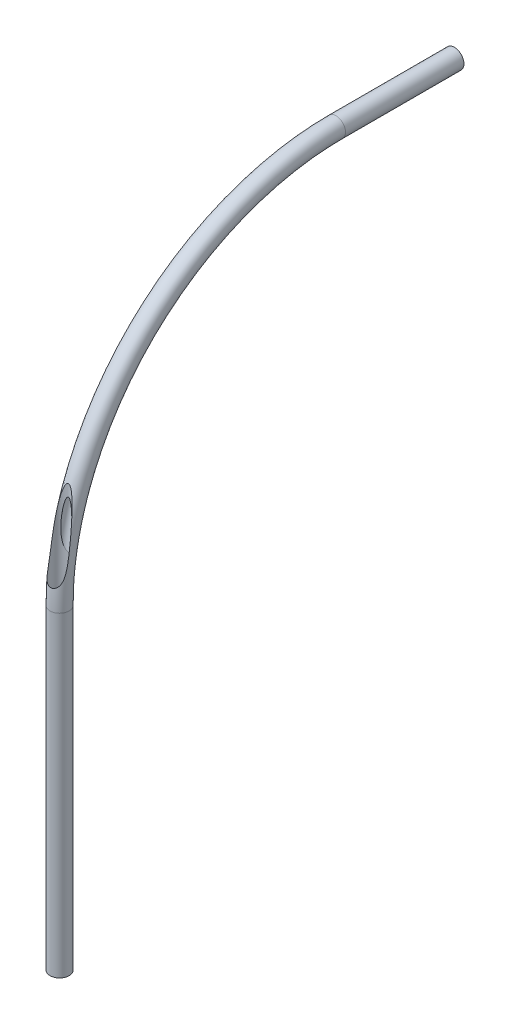
ISO-10303-21;
HEADER;
FILE_DESCRIPTION(('STEP AP214'),'2;1');
FILE_NAME('part.step','',(''),(''),'','','');
FILE_SCHEMA(('AUTOMOTIVE_DESIGN { 1 0 10303 214 1 1 1 1 }'));
ENDSEC;
DATA;
#1=APPLICATION_CONTEXT('core data for automotive mechanical design processes');
#2=APPLICATION_PROTOCOL_DEFINITION('international standard','automotive_design',2000,#1);
#3=PRODUCT_CONTEXT('',#1,'mechanical');
#4=PRODUCT('Part','Part','',(#3));
#5=PRODUCT_RELATED_PRODUCT_CATEGORY('part','',(#4));
#6=PRODUCT_DEFINITION_FORMATION('','',#4);
#7=PRODUCT_DEFINITION_CONTEXT('part definition',#1,'design');
#8=PRODUCT_DEFINITION('design','',#6,#7);
#9=PRODUCT_DEFINITION_SHAPE('','',#8);
#10=(LENGTH_UNIT() NAMED_UNIT(*) SI_UNIT(.MILLI.,.METRE.));
#11=(NAMED_UNIT(*) PLANE_ANGLE_UNIT() SI_UNIT($,.RADIAN.));
#12=(NAMED_UNIT(*) SI_UNIT($,.STERADIAN.) SOLID_ANGLE_UNIT());
#13=UNCERTAINTY_MEASURE_WITH_UNIT(LENGTH_MEASURE(1.E-05),#10,'distance_accuracy_value','');
#14=(GEOMETRIC_REPRESENTATION_CONTEXT(3) GLOBAL_UNCERTAINTY_ASSIGNED_CONTEXT((#13)) GLOBAL_UNIT_ASSIGNED_CONTEXT((#10,
#11,#12)) REPRESENTATION_CONTEXT('',''));
#15=CARTESIAN_POINT('',(0.,0.,0.));
#16=DIRECTION('',(0.,0.,1.));
#17=DIRECTION('',(1.,0.,0.));
#18=AXIS2_PLACEMENT_3D('',#15,#16,#17);
#19=CARTESIAN_POINT('',(0.,350.,0.));
#20=DIRECTION('',(0.,1.,0.));
#21=DIRECTION('',(-1.,0.,0.));
#22=AXIS2_PLACEMENT_3D('',#19,#20,#21);
#23=PLANE('',#22);
#24=CARTESIAN_POINT('',(0.,350.,0.));
#25=DIRECTION('',(0.,-1.,0.));
#26=DIRECTION('',(0.,0.,-1.));
#27=AXIS2_PLACEMENT_3D('',#24,#25,#26);
#28=CIRCLE('',#27,2.25000000000007);
#29=CARTESIAN_POINT('',(0.,350.,-2.25000000000007));
#30=VERTEX_POINT('',#29);
#31=EDGE_CURVE('E68',#30,#30,#28,.T.);
#32=ORIENTED_EDGE('',*,*,#31,.F.);
#33=EDGE_LOOP('',(#32));
#34=FACE_BOUND('',#33,.T.);
#35=CARTESIAN_POINT('',(0.,350.,0.));
#36=DIRECTION('',(0.,1.,0.));
#37=DIRECTION('',(-1.,0.,0.));
#38=AXIS2_PLACEMENT_3D('',#35,#36,#37);
#39=CIRCLE('',#38,2.42500000000002);
#40=CARTESIAN_POINT('',(-2.42500000000002,350.,0.));
#41=VERTEX_POINT('',#40);
#42=EDGE_CURVE('E52',#41,#41,#39,.T.);
#43=ORIENTED_EDGE('',*,*,#42,.F.);
#44=EDGE_LOOP('',(#43));
#45=FACE_BOUND('',#44,.T.);
#46=ADVANCED_FACE('F31',(#34,#45),#23,.F.);
#47=CARTESIAN_POINT('',(0.,500.,-99.9999999999999));
#48=DIRECTION('',(0.,0.,-1.));
#49=DIRECTION('',(-1.,0.,0.));
#50=AXIS2_PLACEMENT_3D('',#47,#48,#49);
#51=PLANE('',#50);
#52=CARTESIAN_POINT('',(0.,500.,-99.9999999999999));
#53=DIRECTION('',(0.,0.,-1.));
#54=DIRECTION('',(-1.,0.,0.));
#55=AXIS2_PLACEMENT_3D('',#52,#53,#54);
#56=CIRCLE('',#55,1.42500000000002);
#57=CARTESIAN_POINT('',(-1.42500000000002,500.,-99.9999999999999));
#58=VERTEX_POINT('',#57);
#59=EDGE_CURVE('E55',#58,#58,#56,.T.);
#60=ORIENTED_EDGE('',*,*,#59,.F.);
#61=EDGE_LOOP('',(#60));
#62=FACE_BOUND('',#61,.T.);
#63=CARTESIAN_POINT('',(0.,500.,-99.9999999999999));
#64=DIRECTION('',(0.,0.,-1.));
#65=DIRECTION('',(-1.,0.,0.));
#66=AXIS2_PLACEMENT_3D('',#63,#64,#65);
#67=CIRCLE('',#66,2.42500000000002);
#68=CARTESIAN_POINT('',(-2.42500000000002,500.,-99.9999999999999));
#69=VERTEX_POINT('',#68);
#70=EDGE_CURVE('E10',#69,#69,#67,.T.);
#71=ORIENTED_EDGE('',*,*,#70,.T.);
#72=EDGE_LOOP('',(#71));
#73=FACE_BOUND('',#72,.T.);
#74=ADVANCED_FACE('F89',(#62,#73),#51,.T.);
#75=CARTESIAN_POINT('',(0.,350.,0.));
#76=DIRECTION('',(0.,1.,0.));
#77=DIRECTION('',(0.,0.,1.));
#78=AXIS2_PLACEMENT_3D('',#75,#76,#77);
#79=CYLINDRICAL_SURFACE('',#78,2.42500000000002);
#80=CARTESIAN_POINT('',(0.,430.,1.11022302462516E-13));
#81=DIRECTION('',(0.,1.,0.));
#82=DIRECTION('',(-1.,0.,0.));
#83=AXIS2_PLACEMENT_3D('',#80,#81,#82);
#84=CIRCLE('',#83,2.42500000000002);
#85=CARTESIAN_POINT('',(-2.42500000000002,430.,1.11022302462516E-13));
#86=VERTEX_POINT('',#85);
#87=EDGE_CURVE('E47',#86,#86,#84,.T.);
#88=ORIENTED_EDGE('',*,*,#87,.F.);
#89=EDGE_LOOP('',(#88));
#90=FACE_BOUND('',#89,.T.);
#91=ORIENTED_EDGE('',*,*,#42,.T.);
#92=EDGE_LOOP('',(#91));
#93=FACE_BOUND('',#92,.T.);
#94=ADVANCED_FACE('F87',(#90,#93),#79,.T.);
#95=CARTESIAN_POINT('',(0.,430.,-70.));
#96=DIRECTION('',(-1.,0.,0.));
#97=DIRECTION('',(0.,0.,1.));
#98=AXIS2_PLACEMENT_3D('',#95,#96,#97);
#99=TOROIDAL_SURFACE('',#98,70.,2.42500000000002);
#100=CARTESIAN_POINT('',(-0.136925640238366,435.035903805882,2.24582977294488));
#101=CARTESIAN_POINT('',(-0.0447121285444941,435.030248499427,2.25144464162612));
#102=CARTESIAN_POINT('',(0.0482916257266537,435.030319142566,2.25137652457365));
#103=CARTESIAN_POINT('',(0.232935579228156,435.041947213999,2.23982724733706));
#104=CARTESIAN_POINT('',(0.324573743855476,435.053520322075,2.22833050802805));
#105=CARTESIAN_POINT('',(0.503498166928304,435.087945050012,2.19482413107601));
#106=CARTESIAN_POINT('',(0.590793171074122,435.11077290306,2.1728366500318));
#107=CARTESIAN_POINT('',(0.758880861558164,435.167266799061,2.11999225440059));
#108=CARTESIAN_POINT('',(0.839675204381693,435.200930069953,2.08913760854677));
#109=CARTESIAN_POINT('',(0.994235066589473,435.278963902119,2.02021450566176));
#110=CARTESIAN_POINT('',(1.06787950694627,435.323484892503,1.98204647424846));
#111=CARTESIAN_POINT('',(1.20583440280703,435.421901284124,1.90128007306322));
#112=CARTESIAN_POINT('',(1.27014080104666,435.475800737961,1.85867979124928));
#113=CARTESIAN_POINT('',(1.41597725975172,435.61770731254,1.75184223101714));
#114=CARTESIAN_POINT('',(1.49232431717926,435.710179411445,1.68645861837156));
#115=CARTESIAN_POINT('',(1.62713129259082,435.907984982988,1.55684169504606));
#116=CARTESIAN_POINT('',(1.68555793160506,436.013341882012,1.49261073056657));
#117=CARTESIAN_POINT('',(1.77878501335359,436.213609360797,1.37941613654526));
#118=CARTESIAN_POINT('',(1.81593622664636,436.307073822862,1.32976092125051));
#119=CARTESIAN_POINT('',(1.88232179506993,436.498572661105,1.23400342291765));
#120=CARTESIAN_POINT('',(1.91155006287342,436.596610483672,1.18790389111422));
#121=CARTESIAN_POINT('',(1.96382662486514,436.79626734371,1.09933364219207));
#122=CARTESIAN_POINT('',(1.98685496291941,436.897896781881,1.05687493596377));
#123=CARTESIAN_POINT('',(2.02799542586161,437.103504625899,0.975605410251766));
#124=CARTESIAN_POINT('',(2.04610952945425,437.207482068006,0.936793126671998));
#125=CARTESIAN_POINT('',(2.0770758773289,437.40781893574,0.865803792729866));
#126=CARTESIAN_POINT('',(2.0902535529971,437.504029493501,0.833343723928609));
#127=CARTESIAN_POINT('',(2.11407966036887,437.697564770048,0.770895108260882));
#128=CARTESIAN_POINT('',(2.12472776611631,437.794889630729,0.74090688023644));
#129=CARTESIAN_POINT('',(2.15366740275651,438.088249143746,0.65419109474308));
#130=CARTESIAN_POINT('',(2.1689377240019,438.285552542363,0.600752681058727));
#131=CARTESIAN_POINT('',(2.19423400312136,438.682630096225,0.500488598164967));
#132=CARTESIAN_POINT('',(2.20424668434474,438.882409214791,0.45367988571751));
#133=CARTESIAN_POINT('',(2.220624727706,439.283258912342,0.36516868749199));
#134=CARTESIAN_POINT('',(2.22698957082436,439.48432967099,0.323466929001904));
#135=CARTESIAN_POINT('',(2.23713285110376,439.888597756201,0.243640647624717));
#136=CARTESIAN_POINT('',(2.2408941269509,440.091800395286,0.205541263337152));
#137=CARTESIAN_POINT('',(2.2464111786216,440.498761947372,0.132232475328161));
#138=CARTESIAN_POINT('',(2.24816682053074,440.702520896607,0.0970232647267562));
#139=CARTESIAN_POINT('',(2.25007391837825,441.110054906151,0.0287951013975803));
#140=CARTESIAN_POINT('',(2.25022808435543,441.313829355519,-0.00422745746109903));
#141=CARTESIAN_POINT('',(2.24918055942928,441.721620823797,-0.0687236135797619));
#142=CARTESIAN_POINT('',(2.24797884928298,441.925637846107,-0.100197188849514));
#143=CARTESIAN_POINT('',(2.24261917288081,442.532274140867,-0.192137805203425));
#144=CARTESIAN_POINT('',(2.23672286962107,442.935114835135,-0.251039718382823));
#145=CARTESIAN_POINT('',(2.22062495289341,443.740974153379,-0.367062528659013));
#146=CARTESIAN_POINT('',(2.21042319703274,444.143992782799,-0.424183366783816));
#147=CARTESIAN_POINT('',(2.18546405014955,444.950296170546,-0.538196658556082));
#148=CARTESIAN_POINT('',(2.17070254341744,445.353580839515,-0.595088858643329));
#149=CARTESIAN_POINT('',(2.13601501014657,446.159816979035,-0.709588846386853));
#150=CARTESIAN_POINT('',(2.11608914421755,446.562768459558,-0.76719661173627));
#151=CARTESIAN_POINT('',(2.07025909985444,447.365481974327,-0.883405856501935));
#152=CARTESIAN_POINT('',(2.04439508802677,447.765247560082,-0.941998312447546));
#153=CARTESIAN_POINT('',(1.98525730545104,448.564005787066,-1.06097487514553));
#154=CARTESIAN_POINT('',(1.95198290112297,448.962998359258,-1.12135913471218));
#155=CARTESIAN_POINT('',(1.87613291564587,449.759443594351,-1.24412797101761));
#156=CARTESIAN_POINT('',(1.83356586515468,450.15689733155,-1.30651066866439));
#157=CARTESIAN_POINT('',(1.76048714609144,450.751651997554,-1.40170206900917));
#158=CARTESIAN_POINT('',(1.7345918366663,450.949651103765,-1.43369963498238));
#159=CARTESIAN_POINT('',(1.67917099883848,451.345050038451,-1.49823203278755));
#160=CARTESIAN_POINT('',(1.64964559826183,451.542449887777,-1.53076684566657));
#161=CARTESIAN_POINT('',(1.5861978898376,451.936856003941,-1.59642309697753));
#162=CARTESIAN_POINT('',(1.5522671309893,452.133860755586,-1.6295455544668));
#163=CARTESIAN_POINT('',(1.47904213676165,452.526869428124,-1.69628729227518));
#164=CARTESIAN_POINT('',(1.43974596662989,452.72287296141,-1.72990674789288));
#165=CARTESIAN_POINT('',(1.35416027062056,453.114249387734,-1.79771117259026));
#166=CARTESIAN_POINT('',(1.3078396604978,453.309615325188,-1.83189802179638));
#167=CARTESIAN_POINT('',(1.23143076690454,453.600750195155,-1.88335056867434));
#168=CARTESIAN_POINT('',(1.20481562588271,453.697447007199,-1.90052487666047));
#169=CARTESIAN_POINT('',(1.14880737056196,453.890024811304,-1.93489671601729));
#170=CARTESIAN_POINT('',(1.11941453688754,453.985905884712,-1.95209424486935));
#171=CARTESIAN_POINT('',(1.05700509393451,454.177274996173,-1.98658544172022));
#172=CARTESIAN_POINT('',(1.02396343384717,454.272754963458,-2.0038788870952));
#173=CARTESIAN_POINT('',(0.95347701413709,454.462243496661,-2.0383642141441));
#174=CARTESIAN_POINT('',(0.916027525463745,454.556250357355,-2.05555596556538));
#175=CARTESIAN_POINT('',(0.835610745122248,454.741177145525,-2.08953310898109));
#176=CARTESIAN_POINT('',(0.792683208618925,454.832113867297,-2.10632048353072));
#177=CARTESIAN_POINT('',(0.698915112598672,455.009867139524,-2.13928127080548));
#178=CARTESIAN_POINT('',(0.648093748817961,455.09669303518,-2.15545605753264));
#179=CARTESIAN_POINT('',(0.562210476533495,455.221659356527,-2.17883038190097));
#180=CARTESIAN_POINT('',(0.531659259966162,455.26277600235,-2.18653803721731));
#181=CARTESIAN_POINT('',(0.466413708796548,455.341813496145,-2.20138292270834));
#182=CARTESIAN_POINT('',(0.431719027795424,455.37973407647,-2.20852010510739));
#183=CARTESIAN_POINT('',(0.366861944222378,455.440972922483,-2.22006545206364));
#184=CARTESIAN_POINT('',(0.337905810884014,455.465509267139,-2.22469779142287));
#185=CARTESIAN_POINT('',(0.276642958350023,455.510186193766,-2.23314135353563));
#186=CARTESIAN_POINT('',(0.244344044564608,455.530336689652,-2.23695442792576));
#187=CARTESIAN_POINT('',(0.186988765160777,455.55877059424,-2.24233883746464));
#188=CARTESIAN_POINT('',(0.162837153469926,455.568793846544,-2.24423819020324));
#189=CARTESIAN_POINT('',(0.113203916343396,455.584879602095,-2.24728731181364));
#190=CARTESIAN_POINT('',(0.0877243304983384,455.590947996525,-2.24843819560425));
#191=CARTESIAN_POINT('',(0.0358526752401443,455.598469003853,-2.24986467722054));
#192=CARTESIAN_POINT('',(0.00945523629939583,455.599887018453,-2.25013371419842));
#193=CARTESIAN_POINT('',(-0.0431441777047188,455.597812427456,-2.24974017911636));
#194=CARTESIAN_POINT('',(-0.0693460697191462,455.594317842878,-2.24907723161808));
#195=CARTESIAN_POINT('',(-0.118320529873663,455.583408069524,-2.24700843568215));
#196=CARTESIAN_POINT('',(-0.141186725722954,455.576383473043,-2.2456766056883));
#197=CARTESIAN_POINT('',(-0.18568485991896,455.559282546134,-2.24243602290609));
#198=CARTESIAN_POINT('',(-0.207316407158441,455.549205254991,-2.2405270884974));
#199=CARTESIAN_POINT('',(-0.265403325559814,455.517920036762,-2.2346045831966));
#200=CARTESIAN_POINT('',(-0.300406640520367,455.494126115059,-2.2301041084732));
#201=CARTESIAN_POINT('',(-0.366470660995118,455.441726700302,-2.22020764511513));
#202=CARTESIAN_POINT('',(-0.397516124262309,455.413103536775,-2.21480836871796));
#203=CARTESIAN_POINT('',(-0.464439708657758,455.344434413099,-2.20187606712897));
#204=CARTESIAN_POINT('',(-0.499275538741127,455.303420152753,-2.19416619488552));
#205=CARTESIAN_POINT('',(-0.564863933192735,455.218306987422,-2.17820240478779));
#206=CARTESIAN_POINT('',(-0.595608394075264,455.174202217338,-2.16994745430714));
#207=CARTESIAN_POINT('',(-0.654031125437229,455.083769286482,-2.15306088256674));
#208=CARTESIAN_POINT('',(-0.681692891630079,455.037430898421,-2.14442754919921));
#209=CARTESIAN_POINT('',(-0.734400632379413,454.943403602508,-2.12695151823145));
#210=CARTESIAN_POINT('',(-0.759449000491373,454.8957159822,-2.1181090214706));
#211=CARTESIAN_POINT('',(-0.826759541183775,454.760570354187,-2.09311144025996));
#212=CARTESIAN_POINT('',(-0.866664528238204,454.671971667743,-2.0767945892231));
#213=CARTESIAN_POINT('',(-0.941532476095888,454.492732328006,-2.04393636259982));
#214=CARTESIAN_POINT('',(-0.976492214741247,454.402090387575,-2.02739484825211));
#215=CARTESIAN_POINT('',(-1.0426430877025,454.219251057871,-1.99418352798549));
#216=CARTESIAN_POINT('',(-1.07382610267548,454.127050786572,-1.97751352483763));
#217=CARTESIAN_POINT('',(-1.13310191149139,453.941660914341,-1.94415305274181));
#218=CARTESIAN_POINT('',(-1.16119422805972,453.848471163041,-1.9274625810343));
#219=CARTESIAN_POINT('',(-1.24175347561911,453.567531943315,-1.877386101431));
#220=CARTESIAN_POINT('',(-1.29041021226853,453.378679590062,-1.84404356071631));
#221=CARTESIAN_POINT('',(-1.35783769057735,453.094229076706,-1.79430746861861));
#222=CARTESIAN_POINT('',(-1.37937448247396,452.999281882793,-1.77778620026582));
#223=CARTESIAN_POINT('',(-1.42082362741015,452.809016933919,-1.74483931886369));
#224=CARTESIAN_POINT('',(-1.44073601948181,452.71369918792,-1.72841370352475));
#225=CARTESIAN_POINT('',(-1.49792789798489,452.429319490083,-1.67964573335152));
#226=CARTESIAN_POINT('',(-1.53313080495487,452.239813101148,-1.64745944996818));
#227=CARTESIAN_POINT('',(-1.59904643039524,451.859935697629,-1.58355676368153));
#228=CARTESIAN_POINT('',(-1.62975875678829,451.669564609041,-1.55184040202458));
#229=CARTESIAN_POINT('',(-1.68745820394587,451.288124174758,-1.48889497541505));
#230=CARTESIAN_POINT('',(-1.71444425240558,451.097054644242,-1.45766605301564));
#231=CARTESIAN_POINT('',(-1.76524429138589,450.71441080733,-1.39571223226925));
#232=CARTESIAN_POINT('',(-1.78905818754476,450.522836486091,-1.3649873489397));
#233=CARTESIAN_POINT('',(-1.85649232416552,449.946874963456,-1.27346487743688));
#234=CARTESIAN_POINT('',(-1.89601200503465,449.561885818379,-1.2134244049619));
#235=CARTESIAN_POINT('',(-1.9666350241153,448.790932387291,-1.09524576258525));
#236=CARTESIAN_POINT('',(-1.99773969723295,448.404968265761,-1.03710729224927));
#237=CARTESIAN_POINT('',(-2.05324055351014,447.631723122009,-0.922371979509058));
#238=CARTESIAN_POINT('',(-2.07762630278458,447.244440986573,-0.865777656438385));
#239=CARTESIAN_POINT('',(-2.12081599604435,446.46937771377,-0.753815583872476));
#240=CARTESIAN_POINT('',(-2.13961970404825,446.081596556004,-0.698447886324511));
#241=CARTESIAN_POINT('',(-2.17246017672525,445.306187877389,-0.588395968878116));
#242=CARTESIAN_POINT('',(-2.18650231867765,444.918560680333,-0.533711045618825));
#243=CARTESIAN_POINT('',(-2.21038867622165,444.143224333817,-0.424072634867211));
#244=CARTESIAN_POINT('',(-2.22023298928646,443.75551518647,-0.369119153640751));
#245=CARTESIAN_POINT('',(-2.23287788124022,443.130407697183,-0.279177342197449));
#246=CARTESIAN_POINT('',(-2.23692980102504,442.892960563927,-0.244701065266714));
#247=CARTESIAN_POINT('',(-2.24348504594929,442.418202655838,-0.174682770847517));
#248=CARTESIAN_POINT('',(-2.24598838201857,442.180891880054,-0.139140760882815));
#249=CARTESIAN_POINT('',(-2.24931692507229,441.706169095487,-0.0663591228045949));
#250=CARTESIAN_POINT('',(-2.25013972380624,441.468757428386,-0.0291171365508756));
#251=CARTESIAN_POINT('',(-2.24982150768334,440.994339952733,0.0477965265547721));
#252=CARTESIAN_POINT('',(-2.24868060928646,440.757334120946,0.0874680591842687));
#253=CARTESIAN_POINT('',(-2.24393949511463,440.284825484398,0.170145175544587));
#254=CARTESIAN_POINT('',(-2.24034841716208,440.049320365377,0.213137846767788));
#255=CARTESIAN_POINT('',(-2.22983549462278,439.579253294033,0.304023452850311));
#256=CARTESIAN_POINT('',(-2.22291273494981,439.344691618698,0.351917731147386));
#257=CARTESIAN_POINT('',(-2.20425252570596,438.877722452851,0.454436794006425));
#258=CARTESIAN_POINT('',(-2.19252575056508,438.645311347177,0.509046470008641));
#259=CARTESIAN_POINT('',(-2.1692811771317,438.298946140295,0.598030021909149));
#260=CARTESIAN_POINT('',(-2.16059347336568,438.183894905244,0.628860755160283));
#261=CARTESIAN_POINT('',(-2.1407928956698,437.954785095397,0.693287233695169));
#262=CARTESIAN_POINT('',(-2.12968029818131,437.84072640899,0.726882663527842));
#263=CARTESIAN_POINT('',(-2.10343372730043,437.605800386471,0.799797795459105));
#264=CARTESIAN_POINT('',(-2.08806848272198,437.48503149762,0.839355242534275));
#265=CARTESIAN_POINT('',(-2.05259827593915,437.245585531778,0.922711384216826));
#266=CARTESIAN_POINT('',(-2.03249127906588,437.126909376333,0.966511894740301));
#267=CARTESIAN_POINT('',(-1.98606074617662,436.89306440388,1.0586398578708));
#268=CARTESIAN_POINT('',(-1.95976135776946,436.777883876954,1.10694929672093));
#269=CARTESIAN_POINT('',(-1.89887805104088,436.551982217522,1.20841286067665));
#270=CARTESIAN_POINT('',(-1.86430129918288,436.441257323709,1.26156277041992));
#271=CARTESIAN_POINT('',(-1.7820096951016,436.219915448031,1.37556306523005));
#272=CARTESIAN_POINT('',(-1.7336584672974,436.109664146043,1.43667966542805));
#273=CARTESIAN_POINT('',(-1.62139812336646,435.899292490706,1.562252696651));
#274=CARTESIAN_POINT('',(-1.55750133454491,435.799164198641,1.62670644966057));
#275=CARTESIAN_POINT('',(-1.42326519109866,435.628241028265,1.74453842342643));
#276=CARTESIAN_POINT('',(-1.35571542452655,435.555330395057,1.79799416791413));
#277=CARTESIAN_POINT('',(-1.20680634578158,435.421605947501,1.90112494061322));
#278=CARTESIAN_POINT('',(-1.12544739984344,435.360791812433,1.95080006904014));
#279=CARTESIAN_POINT('',(-0.993337886154425,435.280047109997,2.01947857354235));
#280=CARTESIAN_POINT('',(-0.947340010624641,435.254768123725,2.04150435018578));
#281=CARTESIAN_POINT('',(-0.852330916475951,435.208058660299,2.08295737967648));
#282=CARTESIAN_POINT('',(-0.803321375197114,435.186626066521,2.10238606016307));
#283=CARTESIAN_POINT('',(-0.702739420495537,435.147815816323,2.13810694012592));
#284=CARTESIAN_POINT('',(-0.651171866991572,435.130430802827,2.15440482070783));
#285=CARTESIAN_POINT('',(-0.545885585311767,435.099799965744,2.18345795467224));
#286=CARTESIAN_POINT('',(-0.492168208188208,435.086551587187,2.1962153942454));
#287=CARTESIAN_POINT('',(-0.388544099794073,435.065384233801,2.21676282624274));
#288=CARTESIAN_POINT('',(-0.338791973146096,435.057065385548,2.22492146318688));
#289=CARTESIAN_POINT('',(-0.238415246487207,435.04388494178,2.23790632036311));
#290=CARTESIAN_POINT('',(-0.187790664218325,435.039023276046,2.2427326082792));
#291=CARTESIAN_POINT('',(-0.136925640238366,435.035903805882,2.24582977294488));
#292=B_SPLINE_CURVE_WITH_KNOTS('',3,(#100,#101,#102,#103,#104,#105,#106,#107,#108,#109,#110,
#111,#112,#113,#114,#115,#116,#117,#118,#119,#120,#121,#122,#123,#124,#125,#126,#127,#128,#129,
#130,#131,#132,#133,#134,#135,#136,#137,#138,#139,#140,#141,#142,#143,#144,#145,#146,#147,#148,
#149,#150,#151,#152,#153,#154,#155,#156,#157,#158,#159,#160,#161,#162,#163,#164,#165,#166,#167,
#168,#169,#170,#171,#172,#173,#174,#175,#176,#177,#178,#179,#180,#181,#182,#183,#184,#185,#186,
#187,#188,#189,#190,#191,#192,#193,#194,#195,#196,#197,#198,#199,#200,#201,#202,#203,#204,#205,
#206,#207,#208,#209,#210,#211,#212,#213,#214,#215,#216,#217,#218,#219,#220,#221,#222,#223,#224,
#225,#226,#227,#228,#229,#230,#231,#232,#233,#234,#235,#236,#237,#238,#239,#240,#241,#242,#243,
#244,#245,#246,#247,#248,#249,#250,#251,#252,#253,#254,#255,#256,#257,#258,#259,#260,#261,#262,
#263,#264,#265,#266,#267,#268,#269,#270,#271,#272,#273,#274,#275,#276,#277,#278,#279,#280,#281,
#282,#283,#284,#285,#286,#287,#288,#289,#290,#291),.UNSPECIFIED.,.T.,.F.,(4,2,2,2,2,2,2,2,2,2,2,
2,2,2,2,2,2,2,2,2,2,2,2,2,2,2,2,2,2,2,2,2,2,2,2,2,2,2,2,2,2,2,2,2,2,2,2,2,2,2,2,2,2,2,2,2,2,2,2,
2,2,2,2,2,2,2,2,2,2,2,2,2,2,2,2,2,2,2,2,2,2,2,2,2,2,2,2,2,2,2,2,2,2,2,2,4),(0.,
0.277476456059646,0.555331678372437,0.832602646710407,1.10980273617447,1.39108640351739,
1.67249192180161,2.07991591110455,2.48809198583562,2.82410625029298,3.16037795288809,
3.49771943529054,3.8349248856767,4.1420182075143,4.44915107944354,5.06378831001218,
5.67997025456833,6.29623984860569,6.9165338401599,7.53686924577926,8.15615474024793,
8.7754490239028,9.996909789712,11.2184109556412,12.4410179073047,13.6635868408894,
14.8781178159083,16.0927526718142,17.3062771458321,17.9129484134746,18.5195983245787,
19.1274296873003,19.7354808140517,20.3463057217638,20.6515324417451,20.9567283582066,
21.2641678406799,21.5719402267376,21.8775941169333,22.1825160484111,22.3377523979058,
22.4930017344516,22.6074379065933,22.7216126533578,22.7999858697465,22.8782420724094,
22.9570791871158,23.0359480694744,23.1075555098207,23.1791855092188,23.3061292590946,
23.433547998254,23.596249875538,23.7592693552132,23.9231234678222,24.0868261676701,
24.3821842869102,24.6777339737918,24.9739081718631,25.2701280420067,25.8634268837081,
26.1596736017635,26.4559131993205,27.0420906679535,27.6283192858367,28.2147162517392,
28.8011306572471,29.9759142872784,31.1505114472924,32.3269225003622,33.5033832792621,
34.678511010903,35.8536114546995,36.573519434836,37.2934223338313,38.0143561492559,
38.735247210101,39.4534643343134,40.1718788381259,40.888705623071,41.2469392500655,
41.6051320592288,41.98901720482,42.3730673748385,42.7556440214266,43.1378906271279,
43.5419187942719,43.9456276138392,44.2829157071848,44.6201948566741,44.790731338825,
44.9611736871226,45.1313037695,45.3013285631327,45.4543878384551,45.6074440048681),.UNSPECIFIED.);
#293=CARTESIAN_POINT('',(-0.136925640238366,435.035903805882,2.24582977294488));
#294=VERTEX_POINT('',#293);
#295=EDGE_CURVE('E61',#294,#294,#292,.T.);
#296=ORIENTED_EDGE('',*,*,#295,.F.);
#297=EDGE_LOOP('',(#296));
#298=FACE_BOUND('',#297,.T.);
#299=CARTESIAN_POINT('',(0.,500.,-70.));
#300=DIRECTION('',(0.,0.,-1.));
#301=DIRECTION('',(-1.,0.,0.));
#302=AXIS2_PLACEMENT_3D('',#299,#300,#301);
#303=CIRCLE('',#302,2.42500000000002);
#304=CARTESIAN_POINT('',(-2.42500000000002,500.,-70.));
#305=VERTEX_POINT('',#304);
#306=EDGE_CURVE('E43',#305,#305,#303,.T.);
#307=ORIENTED_EDGE('',*,*,#306,.F.);
#308=EDGE_LOOP('',(#307));
#309=FACE_BOUND('',#308,.T.);
#310=ORIENTED_EDGE('',*,*,#87,.T.);
#311=EDGE_LOOP('',(#310));
#312=FACE_BOUND('',#311,.T.);
#313=ADVANCED_FACE('F69',(#298,#309,#312),#99,.T.);
#314=CARTESIAN_POINT('',(0.,500.,-70.));
#315=DIRECTION('',(0.,0.,-1.));
#316=DIRECTION('',(-1.,0.,0.));
#317=AXIS2_PLACEMENT_3D('',#314,#315,#316);
#318=CYLINDRICAL_SURFACE('',#317,2.42500000000002);
#319=ORIENTED_EDGE('',*,*,#70,.F.);
#320=EDGE_LOOP('',(#319));
#321=FACE_BOUND('',#320,.T.);
#322=ORIENTED_EDGE('',*,*,#306,.T.);
#323=EDGE_LOOP('',(#322));
#324=FACE_BOUND('',#323,.T.);
#325=ADVANCED_FACE('F83',(#321,#324),#318,.T.);
#326=CARTESIAN_POINT('',(0.,430.,-70.));
#327=DIRECTION('',(-1.,0.,0.));
#328=DIRECTION('',(0.,0.,1.));
#329=AXIS2_PLACEMENT_3D('',#326,#327,#328);
#330=TOROIDAL_SURFACE('',#329,70.,1.42500000000002);
#331=CARTESIAN_POINT('',(-0.35226603056373,440.713326037952,-2.22225305573222));
#332=CARTESIAN_POINT('',(-0.321605354013022,440.693974747937,-2.22711231211345));
#333=CARTESIAN_POINT('',(-0.289624523401625,440.676591307966,-2.23153245846802));
#334=CARTESIAN_POINT('',(-0.22324197526801,440.646863831102,-2.23914623268418));
#335=CARTESIAN_POINT('',(-0.188842397219436,440.634515404692,-2.24234092874745));
#336=CARTESIAN_POINT('',(-0.117956251997013,440.615847411764,-2.24718851493178));
#337=CARTESIAN_POINT('',(-0.0814533455803398,440.609584573502,-2.24882689437408));
#338=CARTESIAN_POINT('',(-0.00788574427601723,440.604003803337,-2.25028618838704));
#339=CARTESIAN_POINT('',(0.029178609069469,440.604681806175,-2.25010816682639));
#340=CARTESIAN_POINT('',(0.0982253789905632,440.612406921909,-2.24808979402201));
#341=CARTESIAN_POINT('',(0.130301036468258,440.618710720317,-2.24644346105943));
#342=CARTESIAN_POINT('',(0.193020608471124,440.636119506466,-2.24192630043228));
#343=CARTESIAN_POINT('',(0.223663710035798,440.647227184571,-2.23905478662936));
#344=CARTESIAN_POINT('',(0.295141410966158,440.678836670307,-2.2309553154954));
#345=CARTESIAN_POINT('',(0.335039258122887,440.701322116483,-2.22524393883239));
#346=CARTESIAN_POINT('',(0.410660621802048,440.752163378094,-2.21254061209679));
#347=CARTESIAN_POINT('',(0.446373871412345,440.78053317759,-2.20554561617625));
#348=CARTESIAN_POINT('',(0.535951041288743,440.861384826799,-2.18598765526033));
#349=CARTESIAN_POINT('',(0.586373851219909,440.917485103765,-2.1727796936757));
#350=CARTESIAN_POINT('',(0.678432186243529,441.0362716122,-2.14581563875113));
#351=CARTESIAN_POINT('',(0.720045116933828,441.098974174794,-2.1320582410615));
#352=CARTESIAN_POINT('',(0.806944311939186,441.246358576881,-2.10095871104325));
#353=CARTESIAN_POINT('',(0.850055896886196,441.332318048878,-2.08367904741621));
#354=CARTESIAN_POINT('',(0.927978732212244,441.508173026672,-2.05015607241277));
#355=CARTESIAN_POINT('',(0.962774446149647,441.598075534163,-2.03391474175539));
#356=CARTESIAN_POINT('',(1.02612364125235,441.780757649774,-2.00270319861772));
#357=CARTESIAN_POINT('',(1.05464464527065,441.873549514361,-1.98773983395245));
#358=CARTESIAN_POINT('',(1.10658742088707,442.060657790882,-1.9592939851715));
#359=CARTESIAN_POINT('',(1.1300134514164,442.154972858153,-1.94581026891341));
#360=CARTESIAN_POINT('',(1.18627201907384,442.404323125135,-1.91230876896181));
#361=CARTESIAN_POINT('',(1.21576511702036,442.560271498016,-1.89350944458816));
#362=CARTESIAN_POINT('',(1.26696268794621,442.873870257688,-1.85963092351066));
#363=CARTESIAN_POINT('',(1.28866271108651,443.031521564102,-1.84455385374169));
#364=CARTESIAN_POINT('',(1.32612791623585,443.348115357072,-1.8178046719129));
#365=CARTESIAN_POINT('',(1.3418813640139,443.507059770782,-1.80613930218159));
#366=CARTESIAN_POINT('',(1.36864297422185,443.825549241059,-1.78594335430295));
#367=CARTESIAN_POINT('',(1.37965062354748,443.985094360691,-1.77741311513306));
#368=CARTESIAN_POINT('',(1.39778540989081,444.304733746201,-1.76318698693878));
#369=CARTESIAN_POINT('',(1.4049074700008,444.464828456803,-1.75749480695198));
#370=CARTESIAN_POINT('',(1.41583924297258,444.785202486258,-1.74869799763342));
#371=CARTESIAN_POINT('',(1.41964879937216,444.945481813473,-1.74559349052764));
#372=CARTESIAN_POINT('',(1.42675607049253,445.426046979586,-1.73980585195878));
#373=CARTESIAN_POINT('',(1.42575193113675,445.746445422232,-1.74063266606912));
#374=CARTESIAN_POINT('',(1.41418411466723,446.382415869005,-1.75003541733463));
#375=CARTESIAN_POINT('',(1.40375485984735,446.6979924752,-1.7585023869724));
#376=CARTESIAN_POINT('',(1.37393001292395,447.328598819052,-1.7819024978156));
#377=CARTESIAN_POINT('',(1.35453098944069,447.643628301072,-1.79683811345918));
#378=CARTESIAN_POINT('',(1.30623429475511,448.272274529904,-1.83225654823173));
#379=CARTESIAN_POINT('',(1.27734827345932,448.585892533564,-1.85273255842536));
#380=CARTESIAN_POINT('',(1.22553366736047,449.055053161373,-1.88705766110318));
#381=CARTESIAN_POINT('',(1.20685161435382,449.211203567853,-1.89909894796565));
#382=CARTESIAN_POINT('',(1.16624713720672,449.522988503209,-1.92430298209385));
#383=CARTESIAN_POINT('',(1.14432487132451,449.678623056902,-1.9374656745747));
#384=CARTESIAN_POINT('',(1.09663703099864,449.989493206231,-1.96485283649553));
#385=CARTESIAN_POINT('',(1.07086485827402,450.144727642144,-1.97907910745247));
#386=CARTESIAN_POINT('',(1.01463417672251,450.454327345852,-2.00848829332146));
#387=CARTESIAN_POINT('',(0.984173742597464,450.608692229434,-2.02367159973367));
#388=CARTESIAN_POINT('',(0.917300598289495,450.915819641515,-2.05485696755373));
#389=CARTESIAN_POINT('',(0.880897607139945,451.068584360059,-2.07085766324697));
#390=CARTESIAN_POINT('',(0.820035568248485,451.295947821477,-2.09535448216857));
#391=CARTESIAN_POINT('',(0.798713640751309,451.371412918468,-2.1035998188784));
#392=CARTESIAN_POINT('',(0.753485843897009,451.5215454732,-2.12022271134945));
#393=CARTESIAN_POINT('',(0.729580481278161,451.596213084223,-2.12860024090685));
#394=CARTESIAN_POINT('',(0.686580136255481,451.720893931157,-2.14276531903883));
#395=CARTESIAN_POINT('',(0.668365576235097,451.771212559717,-2.14853122982793));
#396=CARTESIAN_POINT('',(0.630052470064207,451.871155858253,-2.16007766237958));
#397=CARTESIAN_POINT('',(0.609953189968656,451.920780249164,-2.16585818897401));
#398=CARTESIAN_POINT('',(0.567370474469514,452.019110003817,-2.17740199144745));
#399=CARTESIAN_POINT('',(0.544882928169481,452.067813607202,-2.18316521943194));
#400=CARTESIAN_POINT('',(0.49685556406686,452.163687760854,-2.19459458561067));
#401=CARTESIAN_POINT('',(0.471318431893479,452.210859614164,-2.20026080428057));
#402=CARTESIAN_POINT('',(0.415830592531183,452.303163374148,-2.2114244479679));
#403=CARTESIAN_POINT('',(0.385841763092587,452.348272757072,-2.21691986268331));
#404=CARTESIAN_POINT('',(0.319826068226509,452.433814436524,-2.22740603869325));
#405=CARTESIAN_POINT('',(0.28384419367065,452.474278046189,-2.23240014613637));
#406=CARTESIAN_POINT('',(0.228346506560606,452.522921489081,-2.23843218915897));
#407=CARTESIAN_POINT('',(0.212707811705914,452.535399811153,-2.23998281517748));
#408=CARTESIAN_POINT('',(0.180002896465699,452.558426959423,-2.24284868983438));
#409=CARTESIAN_POINT('',(0.162935595764739,452.568974305849,-2.24416375794022));
#410=CARTESIAN_POINT('',(0.127118227954491,452.587518505723,-2.24647860197964));
#411=CARTESIAN_POINT('',(0.108348815351415,452.595479609359,-2.24747395654023));
#412=CARTESIAN_POINT('',(0.0696354925000552,452.607716207925,-2.24900484390068));
#413=CARTESIAN_POINT('',(0.049694961606373,452.612001799568,-2.24954163636474));
#414=CARTESIAN_POINT('',(0.0112434569313733,452.616029510254,-2.25004613650705));
#415=CARTESIAN_POINT('',(-0.00722520196372567,452.61616165031,-2.25006269551948));
#416=CARTESIAN_POINT('',(-0.0438381116446431,452.612847629221,-2.24964757734603));
#417=CARTESIAN_POINT('',(-0.0619820470719164,452.609398163234,-2.24921548617913));
#418=CARTESIAN_POINT('',(-0.0993113343663078,452.598833532838,-2.24789342142164));
#419=CARTESIAN_POINT('',(-0.118389223409966,452.591354454473,-2.24695800630226));
#420=CARTESIAN_POINT('',(-0.155085708150464,452.573468967539,-2.24472446987772));
#421=CARTESIAN_POINT('',(-0.172701540598827,452.563057172301,-2.24342568117577));
#422=CARTESIAN_POINT('',(-0.217977083009625,452.532320104588,-2.23959863153171));
#423=CARTESIAN_POINT('',(-0.244294757659837,452.510076129998,-2.23683590682063));
#424=CARTESIAN_POINT('',(-0.293526715598893,452.462176583999,-2.23090939249289));
#425=CARTESIAN_POINT('',(-0.31643033082184,452.436510774715,-2.22774440070423));
#426=CARTESIAN_POINT('',(-0.369931316561338,452.370325881617,-2.21961662933749));
#427=CARTESIAN_POINT('',(-0.398965801983213,452.328576201036,-2.2145182964992));
#428=CARTESIAN_POINT('',(-0.453055595342956,452.242567218809,-2.20408549937816));
#429=CARTESIAN_POINT('',(-0.478101522536231,452.198302323619,-2.19875051508476));
#430=CARTESIAN_POINT('',(-0.525356658118075,452.107986503487,-2.18794205334649));
#431=CARTESIAN_POINT('',(-0.547548740064831,452.061926777602,-2.18246795626933));
#432=CARTESIAN_POINT('',(-0.589589526706106,451.968834346759,-2.17148617426961));
#433=CARTESIAN_POINT('',(-0.609440904964091,451.921802825422,-2.16597853537438));
#434=CARTESIAN_POINT('',(-0.667235562970591,451.777187819598,-2.1491742725812));
#435=CARTESIAN_POINT('',(-0.702258066709589,451.678440641961,-2.13787900858149));
#436=CARTESIAN_POINT('',(-0.767081052073478,451.479207446144,-2.11547761057163));
#437=CARTESIAN_POINT('',(-0.796877887101368,451.378720267053,-2.10437161347731));
#438=CARTESIAN_POINT('',(-0.852598816705235,451.176414024304,-2.08242030993209));
#439=CARTESIAN_POINT('',(-0.878514153582161,451.074592496149,-2.07157563798378));
#440=CARTESIAN_POINT('',(-0.927231203588614,450.870166729058,-2.05023024243104));
#441=CARTESIAN_POINT('',(-0.950032481891628,450.767562382922,-2.0397295670153));
#442=CARTESIAN_POINT('',(-1.01464486039192,450.458875625291,-2.00880553289281));
#443=CARTESIAN_POINT('',(-1.05265914038241,450.251940014433,-1.98896240093688));
#444=CARTESIAN_POINT('',(-1.12126294527496,449.836991129054,-1.95109633383945));
#445=CARTESIAN_POINT('',(-1.15186188441101,449.628979567029,-1.93307110791803));
#446=CARTESIAN_POINT('',(-1.21291830319707,449.168896126643,-1.89548765668061));
#447=CARTESIAN_POINT('',(-1.24203741656507,448.916610123065,-1.87638351465955));
#448=CARTESIAN_POINT('',(-1.29329637147404,448.41101230774,-1.84142263615194));
#449=CARTESIAN_POINT('',(-1.3154332832226,448.157700110429,-1.82556726385247));
#450=CARTESIAN_POINT('',(-1.35348669526953,447.650849612079,-1.79753446725259));
#451=CARTESIAN_POINT('',(-1.36941388129646,447.397312458666,-1.78535073305754));
#452=CARTESIAN_POINT('',(-1.39543433401985,446.889763652713,-1.76508788016751));
#453=CARTESIAN_POINT('',(-1.40552744060133,446.635751987343,-1.7570088741266));
#454=CARTESIAN_POINT('',(-1.41764533228625,446.203169671379,-1.74723216198635));
#455=CARTESIAN_POINT('',(-1.42117794845914,446.024666699773,-1.74435044478786));
#456=CARTESIAN_POINT('',(-1.4251319434489,445.667604121417,-1.74112226374204));
#457=CARTESIAN_POINT('',(-1.42555340273787,445.489044516252,-1.74077573432043));
#458=CARTESIAN_POINT('',(-1.42297452802236,445.132064517795,-1.74288449990902));
#459=CARTESIAN_POINT('',(-1.41997612533012,444.953644102815,-1.74533821352732));
#460=CARTESIAN_POINT('',(-1.41006907330085,444.596984394061,-1.7533535677333));
#461=CARTESIAN_POINT('',(-1.40316069285918,444.418745088674,-1.7589149945983));
#462=CARTESIAN_POINT('',(-1.38766226988063,444.120158669606,-1.7711450300233));
#463=CARTESIAN_POINT('',(-1.38033607656724,443.999707235134,-1.77687585590774));
#464=CARTESIAN_POINT('',(-1.36321322821694,443.759075591593,-1.79004679722462));
#465=CARTESIAN_POINT('',(-1.35341669148953,443.638895369813,-1.7974868307983));
#466=CARTESIAN_POINT('',(-1.3308944956219,443.398630326353,-1.81422653762046));
#467=CARTESIAN_POINT('',(-1.31816157788915,443.278546493578,-1.82353081157903));
#468=CARTESIAN_POINT('',(-1.28920016321417,443.038980224614,-1.84412031049307));
#469=CARTESIAN_POINT('',(-1.27297211373856,442.919497713443,-1.85540528183421));
#470=CARTESIAN_POINT('',(-1.23607524356326,442.680391957092,-1.8801912494932));
#471=CARTESIAN_POINT('',(-1.21537004500246,442.560776059502,-1.89371017131284));
#472=CARTESIAN_POINT('',(-1.16847924772501,442.322916099857,-1.9229981681785));
#473=CARTESIAN_POINT('',(-1.14229499925051,442.204671707375,-1.93876668853547));
#474=CARTESIAN_POINT('',(-1.08293142528291,441.970647225327,-1.9725460403318));
#475=CARTESIAN_POINT('',(-1.04977631137713,441.854860094996,-1.99054902447563));
#476=CARTESIAN_POINT('',(-0.9929729076884,441.683866433603,-2.01914463708659));
#477=CARTESIAN_POINT('',(-0.97287395977784,441.627349024341,-2.02893543631912));
#478=CARTESIAN_POINT('',(-0.92988447206093,441.515478123526,-2.04899422858423));
#479=CARTESIAN_POINT('',(-0.906994115848892,441.460124555706,-2.05926219020581));
#480=CARTESIAN_POINT('',(-0.847074839918055,441.326853248541,-2.08481697333242));
#481=CARTESIAN_POINT('',(-0.808261215253807,441.249744119099,-2.10032108152699));
#482=CARTESIAN_POINT('',(-0.743319572319722,441.137999040476,-2.1237933161635));
#483=CARTESIAN_POINT('',(-0.720542790593822,441.101391370461,-2.13165626239144));
#484=CARTESIAN_POINT('',(-0.67240027909825,441.029917071736,-2.14732838419889));
#485=CARTESIAN_POINT('',(-0.647035591621276,440.995049750453,-2.15513758008447));
#486=CARTESIAN_POINT('',(-0.582161190228259,440.913563562813,-2.17374407427888));
#487=CARTESIAN_POINT('',(-0.541154111800394,440.868083737365,-2.18443427904957));
#488=CARTESIAN_POINT('',(-0.452090978251702,440.784323746775,-2.20458204412772));
#489=CARTESIAN_POINT('',(-0.404062273519783,440.7460169056,-2.21404412975853));
#490=CARTESIAN_POINT('',(-0.35226603056373,440.713326037952,-2.22225305573222));
#491=B_SPLINE_CURVE_WITH_KNOTS('',3,(#331,#332,#333,#334,#335,#336,#337,#338,#339,#340,#341,
#342,#343,#344,#345,#346,#347,#348,#349,#350,#351,#352,#353,#354,#355,#356,#357,#358,#359,#360,
#361,#362,#363,#364,#365,#366,#367,#368,#369,#370,#371,#372,#373,#374,#375,#376,#377,#378,#379,
#380,#381,#382,#383,#384,#385,#386,#387,#388,#389,#390,#391,#392,#393,#394,#395,#396,#397,#398,
#399,#400,#401,#402,#403,#404,#405,#406,#407,#408,#409,#410,#411,#412,#413,#414,#415,#416,#417,
#418,#419,#420,#421,#422,#423,#424,#425,#426,#427,#428,#429,#430,#431,#432,#433,#434,#435,#436,
#437,#438,#439,#440,#441,#442,#443,#444,#445,#446,#447,#448,#449,#450,#451,#452,#453,#454,#455,
#456,#457,#458,#459,#460,#461,#462,#463,#464,#465,#466,#467,#468,#469,#470,#471,#472,#473,#474,
#475,#476,#477,#478,#479,#480,#481,#482,#483,#484,#485,#486,#487,#488,#489,#490),.UNSPECIFIED.,
.T.,.F.,(4,2,2,2,2,2,2,2,2,2,2,2,2,2,2,2,2,2,2,2,2,2,2,2,2,2,2,2,2,2,2,2,2,2,2,2,2,2,2,2,2,2,2,
2,2,2,2,2,2,2,2,2,2,2,2,2,2,2,2,2,2,2,2,2,2,2,2,2,2,2,2,2,2,2,2,2,2,2,2,4),(0.,
0.109640636798693,0.219185483577498,0.329741952415757,0.440233671889888,0.53798666689375,
0.635794478537891,0.773467632896734,0.911471792713082,1.13990684863214,1.36892085117804,
1.66136315531607,1.9543476278937,2.24881462650008,2.54303452347126,3.02214019650149,
3.50151900511965,3.98183887571897,4.46221066432824,4.94320861224015,5.42422927828977,
6.38511309808129,7.33250526256565,8.28026015159809,9.22685553483554,9.69999865937011,
10.1731186823166,10.6470590826773,11.1211946349715,11.5945623693026,11.8310848298082,
12.0675609805821,12.229003680356,12.3905095120938,12.5522979915103,12.7139450276982,
12.8770660588829,13.0390135668668,13.0991052822735,13.1592428569841,13.2201794655772,
13.2809481388212,13.3359915134289,13.3910857231446,13.4522863163144,13.513600061043,
13.6167228218627,13.7201613483698,13.8730972729011,14.0263877402787,14.1805590012543,
14.3345524252935,14.650441869111,14.9665508785602,15.2833627048174,15.6002187234496,
16.2339946600415,16.8669617134126,17.6308516201424,18.3950616365902,19.1579507301956,
19.9208607601254,20.4565055019542,20.9921363889341,21.527464936666,22.06275667348,
22.4251554567593,22.7875368873577,23.1508238959395,23.5140644220741,23.8803753827279,
24.2465961767973,24.6115654063125,24.7938345131901,24.9760916384665,25.2386838255121,
25.3700741037972,25.501411671298,25.6873375690382,25.8725576522314),.UNSPECIFIED.);
#492=CARTESIAN_POINT('',(-0.35226603056373,440.713326037952,-2.22225305573222));
#493=VERTEX_POINT('',#492);
#494=EDGE_CURVE('E34',#493,#493,#491,.T.);
#495=ORIENTED_EDGE('',*,*,#494,.T.);
#496=EDGE_LOOP('',(#495));
#497=FACE_BOUND('',#496,.T.);
#498=CARTESIAN_POINT('',(0.,500.,-70.));
#499=DIRECTION('',(0.,0.,-1.));
#500=DIRECTION('',(-1.,0.,0.));
#501=AXIS2_PLACEMENT_3D('',#498,#499,#500);
#502=CIRCLE('',#501,1.42500000000002);
#503=CARTESIAN_POINT('',(-1.42500000000002,500.,-70.));
#504=VERTEX_POINT('',#503);
#505=EDGE_CURVE('E58',#504,#504,#502,.T.);
#506=ORIENTED_EDGE('',*,*,#505,.T.);
#507=EDGE_LOOP('',(#506));
#508=FACE_BOUND('',#507,.T.);
#509=ADVANCED_FACE('F78',(#497,#508),#330,.F.);
#510=CARTESIAN_POINT('',(0.,500.,-70.));
#511=DIRECTION('',(0.,0.,-1.));
#512=DIRECTION('',(-1.,0.,0.));
#513=AXIS2_PLACEMENT_3D('',#510,#511,#512);
#514=CYLINDRICAL_SURFACE('',#513,1.42500000000002);
#515=ORIENTED_EDGE('',*,*,#59,.T.);
#516=EDGE_LOOP('',(#515));
#517=FACE_BOUND('',#516,.T.);
#518=ORIENTED_EDGE('',*,*,#505,.F.);
#519=EDGE_LOOP('',(#518));
#520=FACE_BOUND('',#519,.T.);
#521=ADVANCED_FACE('F76',(#517,#520),#514,.F.);
#522=CARTESIAN_POINT('',(0.,459.,0.));
#523=DIRECTION('',(0.,-1.,0.));
#524=DIRECTION('',(0.,0.,-1.));
#525=AXIS2_PLACEMENT_3D('',#522,#523,#524);
#526=CYLINDRICAL_SURFACE('',#525,2.25000000000007);
#527=ORIENTED_EDGE('',*,*,#295,.T.);
#528=EDGE_LOOP('',(#527));
#529=FACE_BOUND('',#528,.T.);
#530=ORIENTED_EDGE('',*,*,#31,.T.);
#531=EDGE_LOOP('',(#530));
#532=FACE_BOUND('',#531,.T.);
#533=ORIENTED_EDGE('',*,*,#494,.F.);
#534=EDGE_LOOP('',(#533));
#535=FACE_BOUND('',#534,.T.);
#536=ADVANCED_FACE('F73',(#529,#532,#535),#526,.F.);
#537=CLOSED_SHELL('',(#46,#74,#94,#313,#325,#509,#521,#536));
#538=MANIFOLD_SOLID_BREP('B2',#537);
#539=ADVANCED_BREP_SHAPE_REPRESENTATION('',(#18,#538),#14);
#540=SHAPE_DEFINITION_REPRESENTATION(#9,#539);
ENDSEC;
END-ISO-10303-21;
